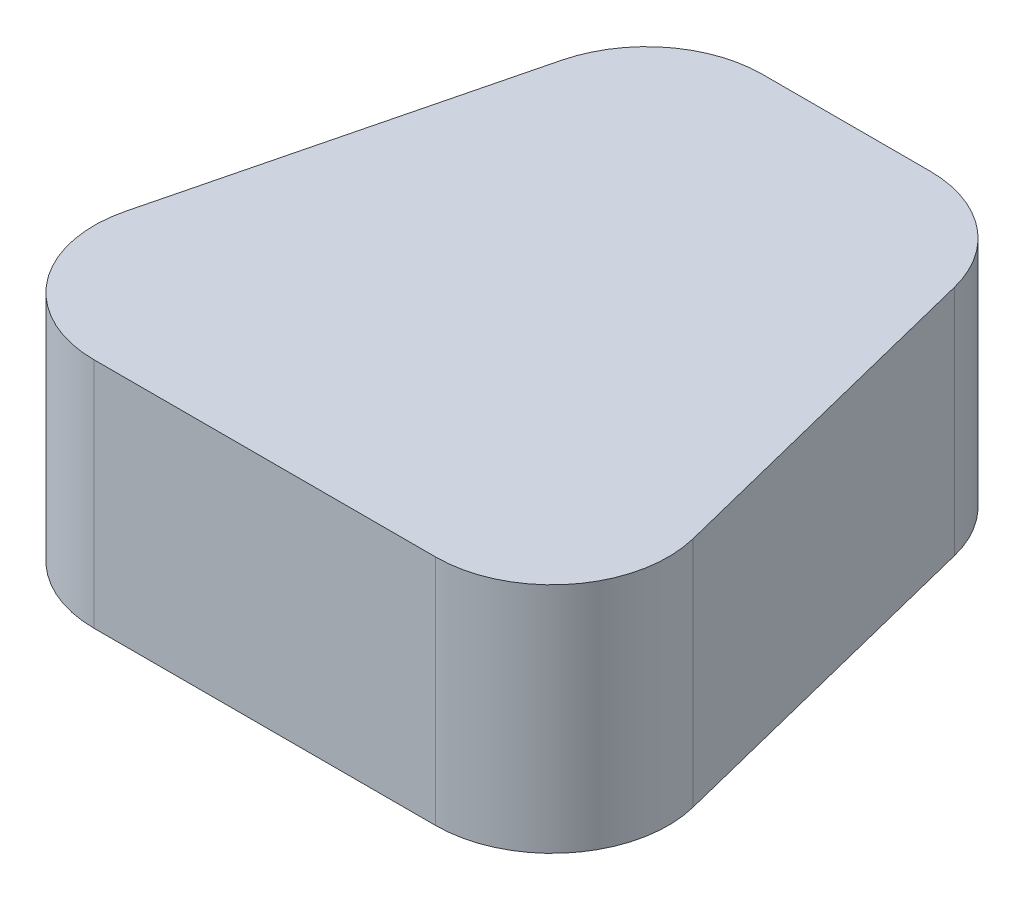
ISO-10303-21;
HEADER;
FILE_DESCRIPTION(('STEP AP214'),'2;1');
FILE_NAME('part.step','',(''),(''),'','','');
FILE_SCHEMA(('AUTOMOTIVE_DESIGN { 1 0 10303 214 1 1 1 1 }'));
ENDSEC;
DATA;
#1=APPLICATION_CONTEXT('core data for automotive mechanical design processes');
#2=APPLICATION_PROTOCOL_DEFINITION('international standard','automotive_design',2000,#1);
#3=PRODUCT_CONTEXT('',#1,'mechanical');
#4=PRODUCT('Part','Part','',(#3));
#5=PRODUCT_RELATED_PRODUCT_CATEGORY('part','',(#4));
#6=PRODUCT_DEFINITION_FORMATION('','',#4);
#7=PRODUCT_DEFINITION_CONTEXT('part definition',#1,'design');
#8=PRODUCT_DEFINITION('design','',#6,#7);
#9=PRODUCT_DEFINITION_SHAPE('','',#8);
#10=(LENGTH_UNIT() NAMED_UNIT(*) SI_UNIT(.MILLI.,.METRE.));
#11=(NAMED_UNIT(*) PLANE_ANGLE_UNIT() SI_UNIT($,.RADIAN.));
#12=(NAMED_UNIT(*) SI_UNIT($,.STERADIAN.) SOLID_ANGLE_UNIT());
#13=UNCERTAINTY_MEASURE_WITH_UNIT(LENGTH_MEASURE(1.E-05),#10,'distance_accuracy_value','');
#14=(GEOMETRIC_REPRESENTATION_CONTEXT(3) GLOBAL_UNCERTAINTY_ASSIGNED_CONTEXT((#13)) GLOBAL_UNIT_ASSIGNED_CONTEXT((#10,
#11,#12)) REPRESENTATION_CONTEXT('',''));
#15=CARTESIAN_POINT('',(0.,0.,0.));
#16=DIRECTION('',(0.,0.,1.));
#17=DIRECTION('',(1.,0.,0.));
#18=AXIS2_PLACEMENT_3D('',#15,#16,#17);
#19=CARTESIAN_POINT('',(-27.5,20.,25.));
#20=DIRECTION('',(0.970142500145332,0.,0.242535625036333));
#21=DIRECTION('',(0.242535625036333,0.,-0.970142500145332));
#22=AXIS2_PLACEMENT_3D('',#19,#20,#21);
#23=PLANE('',#22);
#24=DIRECTION('',(-0.242535625036333,0.,0.970142500145332));
#25=VECTOR('',#24,1.);
#26=CARTESIAN_POINT('',(-27.5,20.,25.));
#27=LINE('',#26,#25);
#28=CARTESIAN_POINT('',(-16.8936609374092,20.,-17.4253562503633));
#29=VERTEX_POINT('',#28);
#30=CARTESIAN_POINT('',(-24.3936609374092,20.,12.5746437496367));
#31=VERTEX_POINT('',#30);
#32=EDGE_CURVE('E118',#29,#31,#27,.T.);
#33=ORIENTED_EDGE('',*,*,#32,.F.);
#34=DIRECTION('',(0.,-1.,0.));
#35=VECTOR('',#34,1.);
#36=CARTESIAN_POINT('',(-16.8936609374092,20.,-17.4253562503633));
#37=LINE('',#36,#35);
#38=CARTESIAN_POINT('',(-16.8936609374092,0.,-17.4253562503633));
#39=VERTEX_POINT('',#38);
#40=EDGE_CURVE('E103',#29,#39,#37,.T.);
#41=ORIENTED_EDGE('',*,*,#40,.T.);
#42=DIRECTION('',(-0.242535625036333,0.,0.970142500145332));
#43=VECTOR('',#42,1.);
#44=CARTESIAN_POINT('',(-27.5,0.,25.));
#45=LINE('',#44,#43);
#46=CARTESIAN_POINT('',(-24.3936609374092,0.,12.5746437496367));
#47=VERTEX_POINT('',#46);
#48=EDGE_CURVE('E115',#39,#47,#45,.T.);
#49=ORIENTED_EDGE('',*,*,#48,.T.);
#50=DIRECTION('',(0.,-1.,0.));
#51=VECTOR('',#50,1.);
#52=CARTESIAN_POINT('',(-24.3936609374092,20.,12.5746437496367));
#53=LINE('',#52,#51);
#54=EDGE_CURVE('E120',#47,#31,#53,.F.);
#55=ORIENTED_EDGE('',*,*,#54,.T.);
#56=EDGE_LOOP('',(#33,#41,#49,#55));
#57=FACE_BOUND('',#56,.T.);
#58=ADVANCED_FACE('F33',(#57),#23,.F.);
#59=CARTESIAN_POINT('',(27.5,20.,25.));
#60=DIRECTION('',(0.,0.,-1.));
#61=DIRECTION('',(-1.,0.,0.));
#62=AXIS2_PLACEMENT_3D('',#59,#60,#61);
#63=PLANE('',#62);
#64=DIRECTION('',(1.,0.,0.));
#65=VECTOR('',#64,1.);
#66=CARTESIAN_POINT('',(27.5,0.,25.));
#67=LINE('',#66,#65);
#68=CARTESIAN_POINT('',(-14.6922359359558,0.,25.));
#69=VERTEX_POINT('',#68);
#70=CARTESIAN_POINT('',(14.6922359359559,0.,25.));
#71=VERTEX_POINT('',#70);
#72=EDGE_CURVE('E124',#69,#71,#67,.T.);
#73=ORIENTED_EDGE('',*,*,#72,.T.);
#74=DIRECTION('',(0.,-1.,0.));
#75=VECTOR('',#74,1.);
#76=CARTESIAN_POINT('',(14.6922359359559,20.,25.));
#77=LINE('',#76,#75);
#78=CARTESIAN_POINT('',(14.6922359359559,20.,25.));
#79=VERTEX_POINT('',#78);
#80=EDGE_CURVE('E11',#71,#79,#77,.F.);
#81=ORIENTED_EDGE('',*,*,#80,.T.);
#82=DIRECTION('',(1.,0.,0.));
#83=VECTOR('',#82,1.);
#84=CARTESIAN_POINT('',(27.5,20.,25.));
#85=LINE('',#84,#83);
#86=CARTESIAN_POINT('',(-14.6922359359558,20.,25.));
#87=VERTEX_POINT('',#86);
#88=EDGE_CURVE('E160',#87,#79,#85,.T.);
#89=ORIENTED_EDGE('',*,*,#88,.F.);
#90=DIRECTION('',(0.,-1.,0.));
#91=VECTOR('',#90,1.);
#92=CARTESIAN_POINT('',(-14.6922359359558,20.,25.));
#93=LINE('',#92,#91);
#94=EDGE_CURVE('E41',#87,#69,#93,.T.);
#95=ORIENTED_EDGE('',*,*,#94,.T.);
#96=EDGE_LOOP('',(#73,#81,#89,#95));
#97=FACE_BOUND('',#96,.T.);
#98=ADVANCED_FACE('F158',(#97),#63,.F.);
#99=CARTESIAN_POINT('',(15.,20.,-25.));
#100=DIRECTION('',(-0.970142500145332,0.,0.242535625036333));
#101=DIRECTION('',(0.242535625036333,0.,0.970142500145332));
#102=AXIS2_PLACEMENT_3D('',#99,#100,#101);
#103=PLANE('',#102);
#104=DIRECTION('',(-0.242535625036333,0.,-0.970142500145332));
#105=VECTOR('',#104,1.);
#106=CARTESIAN_POINT('',(15.,0.,-25.));
#107=LINE('',#106,#105);
#108=CARTESIAN_POINT('',(24.3936609374092,0.,12.5746437496367));
#109=VERTEX_POINT('',#108);
#110=CARTESIAN_POINT('',(16.8936609374092,0.,-17.4253562503633));
#111=VERTEX_POINT('',#110);
#112=EDGE_CURVE('E127',#109,#111,#107,.T.);
#113=ORIENTED_EDGE('',*,*,#112,.T.);
#114=DIRECTION('',(0.,-1.,0.));
#115=VECTOR('',#114,1.);
#116=CARTESIAN_POINT('',(16.8936609374092,20.,-17.4253562503633));
#117=LINE('',#116,#115);
#118=CARTESIAN_POINT('',(16.8936609374092,20.,-17.4253562503633));
#119=VERTEX_POINT('',#118);
#120=EDGE_CURVE('E48',#111,#119,#117,.F.);
#121=ORIENTED_EDGE('',*,*,#120,.T.);
#122=DIRECTION('',(-0.242535625036333,0.,-0.970142500145332));
#123=VECTOR('',#122,1.);
#124=CARTESIAN_POINT('',(15.,20.,-25.));
#125=LINE('',#124,#123);
#126=CARTESIAN_POINT('',(24.3936609374092,20.,12.5746437496367));
#127=VERTEX_POINT('',#126);
#128=EDGE_CURVE('E168',#127,#119,#125,.T.);
#129=ORIENTED_EDGE('',*,*,#128,.F.);
#130=DIRECTION('',(0.,-1.,0.));
#131=VECTOR('',#130,1.);
#132=CARTESIAN_POINT('',(24.3936609374092,20.,12.5746437496367));
#133=LINE('',#132,#131);
#134=EDGE_CURVE('E151',#127,#109,#133,.T.);
#135=ORIENTED_EDGE('',*,*,#134,.T.);
#136=EDGE_LOOP('',(#113,#121,#129,#135));
#137=FACE_BOUND('',#136,.T.);
#138=ADVANCED_FACE('F167',(#137),#103,.F.);
#139=CARTESIAN_POINT('',(-15.,20.,-25.));
#140=DIRECTION('',(0.,0.,1.));
#141=DIRECTION('',(1.,0.,0.));
#142=AXIS2_PLACEMENT_3D('',#139,#140,#141);
#143=PLANE('',#142);
#144=DIRECTION('',(-1.,0.,0.));
#145=VECTOR('',#144,1.);
#146=CARTESIAN_POINT('',(-15.,0.,-25.));
#147=LINE('',#146,#145);
#148=CARTESIAN_POINT('',(7.19223593595584,0.,-25.));
#149=VERTEX_POINT('',#148);
#150=CARTESIAN_POINT('',(-7.19223593595585,0.,-25.));
#151=VERTEX_POINT('',#150);
#152=EDGE_CURVE('E134',#149,#151,#147,.T.);
#153=ORIENTED_EDGE('',*,*,#152,.T.);
#154=DIRECTION('',(0.,-1.,0.));
#155=VECTOR('',#154,1.);
#156=CARTESIAN_POINT('',(-7.19223593595585,20.,-25.));
#157=LINE('',#156,#155);
#158=CARTESIAN_POINT('',(-7.19223593595585,20.,-25.));
#159=VERTEX_POINT('',#158);
#160=EDGE_CURVE('E104',#151,#159,#157,.F.);
#161=ORIENTED_EDGE('',*,*,#160,.T.);
#162=DIRECTION('',(-1.,0.,0.));
#163=VECTOR('',#162,1.);
#164=CARTESIAN_POINT('',(-15.,20.,-25.));
#165=LINE('',#164,#163);
#166=CARTESIAN_POINT('',(7.19223593595584,20.,-25.));
#167=VERTEX_POINT('',#166);
#168=EDGE_CURVE('E130',#167,#159,#165,.T.);
#169=ORIENTED_EDGE('',*,*,#168,.F.);
#170=DIRECTION('',(0.,-1.,0.));
#171=VECTOR('',#170,1.);
#172=CARTESIAN_POINT('',(7.19223593595584,20.,-25.));
#173=LINE('',#172,#171);
#174=EDGE_CURVE('E109',#167,#149,#173,.T.);
#175=ORIENTED_EDGE('',*,*,#174,.T.);
#176=EDGE_LOOP('',(#153,#161,#169,#175));
#177=FACE_BOUND('',#176,.T.);
#178=ADVANCED_FACE('F196',(#177),#143,.F.);
#179=CARTESIAN_POINT('',(0.,20.,0.));
#180=DIRECTION('',(0.,-1.,0.));
#181=DIRECTION('',(0.,0.,-1.));
#182=AXIS2_PLACEMENT_3D('',#179,#180,#181);
#183=PLANE('',#182);
#184=ORIENTED_EDGE('',*,*,#168,.T.);
#185=CARTESIAN_POINT('',(-7.19223593595585,20.,-15.));
#186=DIRECTION('',(0.,-1.,0.));
#187=DIRECTION('',(0.,0.,-1.));
#188=AXIS2_PLACEMENT_3D('',#185,#186,#187);
#189=CIRCLE('',#188,10.);
#190=EDGE_CURVE('E149',#159,#29,#189,.F.);
#191=ORIENTED_EDGE('',*,*,#190,.T.);
#192=ORIENTED_EDGE('',*,*,#32,.T.);
#193=CARTESIAN_POINT('',(-14.6922359359558,20.,15.));
#194=DIRECTION('',(0.,-1.,0.));
#195=DIRECTION('',(0.,0.,-1.));
#196=AXIS2_PLACEMENT_3D('',#193,#194,#195);
#197=CIRCLE('',#196,10.);
#198=EDGE_CURVE('E144',#31,#87,#197,.F.);
#199=ORIENTED_EDGE('',*,*,#198,.T.);
#200=ORIENTED_EDGE('',*,*,#88,.T.);
#201=CARTESIAN_POINT('',(14.6922359359559,20.,15.));
#202=DIRECTION('',(0.,-1.,0.));
#203=DIRECTION('',(0.,0.,-1.));
#204=AXIS2_PLACEMENT_3D('',#201,#202,#203);
#205=CIRCLE('',#204,10.);
#206=EDGE_CURVE('E55',#79,#127,#205,.F.);
#207=ORIENTED_EDGE('',*,*,#206,.T.);
#208=ORIENTED_EDGE('',*,*,#128,.T.);
#209=CARTESIAN_POINT('',(7.19223593595584,20.,-15.));
#210=DIRECTION('',(0.,-1.,0.));
#211=DIRECTION('',(0.,0.,-1.));
#212=AXIS2_PLACEMENT_3D('',#209,#210,#211);
#213=CIRCLE('',#212,10.);
#214=EDGE_CURVE('E147',#119,#167,#213,.F.);
#215=ORIENTED_EDGE('',*,*,#214,.T.);
#216=EDGE_LOOP('',(#184,#191,#192,#199,#200,#207,#208,#215));
#217=FACE_BOUND('',#216,.T.);
#218=ADVANCED_FACE('F173',(#217),#183,.F.);
#219=CARTESIAN_POINT('',(0.,0.,0.));
#220=DIRECTION('',(0.,-1.,0.));
#221=DIRECTION('',(0.,0.,-1.));
#222=AXIS2_PLACEMENT_3D('',#219,#220,#221);
#223=PLANE('',#222);
#224=ORIENTED_EDGE('',*,*,#48,.F.);
#225=CARTESIAN_POINT('',(-7.19223593595585,0.,-15.));
#226=DIRECTION('',(0.,-1.,0.));
#227=DIRECTION('',(0.,0.,-1.));
#228=AXIS2_PLACEMENT_3D('',#225,#226,#227);
#229=CIRCLE('',#228,10.);
#230=EDGE_CURVE('E99',#39,#151,#229,.T.);
#231=ORIENTED_EDGE('',*,*,#230,.T.);
#232=ORIENTED_EDGE('',*,*,#152,.F.);
#233=CARTESIAN_POINT('',(7.19223593595584,0.,-15.));
#234=DIRECTION('',(0.,-1.,0.));
#235=DIRECTION('',(0.,0.,-1.));
#236=AXIS2_PLACEMENT_3D('',#233,#234,#235);
#237=CIRCLE('',#236,10.);
#238=EDGE_CURVE('E110',#149,#111,#237,.T.);
#239=ORIENTED_EDGE('',*,*,#238,.T.);
#240=ORIENTED_EDGE('',*,*,#112,.F.);
#241=CARTESIAN_POINT('',(14.6922359359559,0.,15.));
#242=DIRECTION('',(0.,-1.,0.));
#243=DIRECTION('',(0.,0.,-1.));
#244=AXIS2_PLACEMENT_3D('',#241,#242,#243);
#245=CIRCLE('',#244,10.);
#246=EDGE_CURVE('E138',#109,#71,#245,.T.);
#247=ORIENTED_EDGE('',*,*,#246,.T.);
#248=ORIENTED_EDGE('',*,*,#72,.F.);
#249=CARTESIAN_POINT('',(-14.6922359359558,0.,15.));
#250=DIRECTION('',(0.,-1.,0.));
#251=DIRECTION('',(0.,0.,-1.));
#252=AXIS2_PLACEMENT_3D('',#249,#250,#251);
#253=CIRCLE('',#252,10.);
#254=EDGE_CURVE('E119',#69,#47,#253,.T.);
#255=ORIENTED_EDGE('',*,*,#254,.T.);
#256=EDGE_LOOP('',(#224,#231,#232,#239,#240,#247,#248,#255));
#257=FACE_BOUND('',#256,.T.);
#258=ADVANCED_FACE('F122',(#257),#223,.T.);
#259=CARTESIAN_POINT('',(-7.19223593595585,20.,-15.));
#260=DIRECTION('',(0.,-1.,0.));
#261=DIRECTION('',(0.,0.,-1.));
#262=AXIS2_PLACEMENT_3D('',#259,#260,#261);
#263=CYLINDRICAL_SURFACE('',#262,10.);
#264=ORIENTED_EDGE('',*,*,#190,.F.);
#265=ORIENTED_EDGE('',*,*,#160,.F.);
#266=ORIENTED_EDGE('',*,*,#230,.F.);
#267=ORIENTED_EDGE('',*,*,#40,.F.);
#268=EDGE_LOOP('',(#264,#265,#266,#267));
#269=FACE_BOUND('',#268,.T.);
#270=ADVANCED_FACE('F102',(#269),#263,.T.);
#271=CARTESIAN_POINT('',(7.19223593595584,20.,-15.));
#272=DIRECTION('',(0.,-1.,0.));
#273=DIRECTION('',(0.,0.,-1.));
#274=AXIS2_PLACEMENT_3D('',#271,#272,#273);
#275=CYLINDRICAL_SURFACE('',#274,10.);
#276=ORIENTED_EDGE('',*,*,#214,.F.);
#277=ORIENTED_EDGE('',*,*,#120,.F.);
#278=ORIENTED_EDGE('',*,*,#238,.F.);
#279=ORIENTED_EDGE('',*,*,#174,.F.);
#280=EDGE_LOOP('',(#276,#277,#278,#279));
#281=FACE_BOUND('',#280,.T.);
#282=ADVANCED_FACE('F178',(#281),#275,.T.);
#283=CARTESIAN_POINT('',(14.6922359359559,20.,15.));
#284=DIRECTION('',(0.,-1.,0.));
#285=DIRECTION('',(0.,0.,-1.));
#286=AXIS2_PLACEMENT_3D('',#283,#284,#285);
#287=CYLINDRICAL_SURFACE('',#286,10.);
#288=ORIENTED_EDGE('',*,*,#206,.F.);
#289=ORIENTED_EDGE('',*,*,#80,.F.);
#290=ORIENTED_EDGE('',*,*,#246,.F.);
#291=ORIENTED_EDGE('',*,*,#134,.F.);
#292=EDGE_LOOP('',(#288,#289,#290,#291));
#293=FACE_BOUND('',#292,.T.);
#294=ADVANCED_FACE('F166',(#293),#287,.T.);
#295=CARTESIAN_POINT('',(-14.6922359359558,20.,15.));
#296=DIRECTION('',(0.,-1.,0.));
#297=DIRECTION('',(0.,0.,-1.));
#298=AXIS2_PLACEMENT_3D('',#295,#296,#297);
#299=CYLINDRICAL_SURFACE('',#298,10.);
#300=ORIENTED_EDGE('',*,*,#198,.F.);
#301=ORIENTED_EDGE('',*,*,#54,.F.);
#302=ORIENTED_EDGE('',*,*,#254,.F.);
#303=ORIENTED_EDGE('',*,*,#94,.F.);
#304=EDGE_LOOP('',(#300,#301,#302,#303));
#305=FACE_BOUND('',#304,.T.);
#306=ADVANCED_FACE('F35',(#305),#299,.T.);
#307=CLOSED_SHELL('',(#58,#98,#138,#178,#218,#258,#270,#282,#294,#306));
#308=MANIFOLD_SOLID_BREP('B2',#307);
#309=ADVANCED_BREP_SHAPE_REPRESENTATION('',(#18,#308),#14);
#310=SHAPE_DEFINITION_REPRESENTATION(#9,#309);
ENDSEC;
END-ISO-10303-21;
